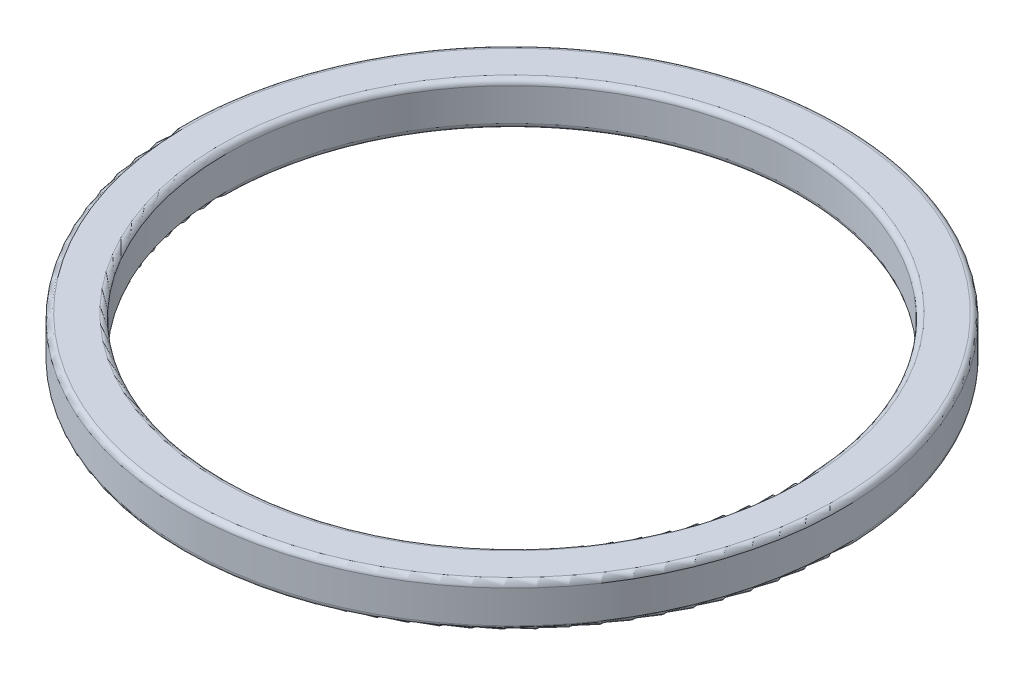
ISO-10303-21;
HEADER;
FILE_DESCRIPTION(('STEP AP214'),'2;1');
FILE_NAME('part.step','',(''),(''),'','','');
FILE_SCHEMA(('AUTOMOTIVE_DESIGN { 1 0 10303 214 1 1 1 1 }'));
ENDSEC;
DATA;
#1=APPLICATION_CONTEXT('core data for automotive mechanical design processes');
#2=APPLICATION_PROTOCOL_DEFINITION('international standard','automotive_design',2000,#1);
#3=PRODUCT_CONTEXT('',#1,'mechanical');
#4=PRODUCT('Part','Part','',(#3));
#5=PRODUCT_RELATED_PRODUCT_CATEGORY('part','',(#4));
#6=PRODUCT_DEFINITION_FORMATION('','',#4);
#7=PRODUCT_DEFINITION_CONTEXT('part definition',#1,'design');
#8=PRODUCT_DEFINITION('design','',#6,#7);
#9=PRODUCT_DEFINITION_SHAPE('','',#8);
#10=(LENGTH_UNIT() NAMED_UNIT(*) SI_UNIT(.MILLI.,.METRE.));
#11=(NAMED_UNIT(*) PLANE_ANGLE_UNIT() SI_UNIT($,.RADIAN.));
#12=(NAMED_UNIT(*) SI_UNIT($,.STERADIAN.) SOLID_ANGLE_UNIT());
#13=UNCERTAINTY_MEASURE_WITH_UNIT(LENGTH_MEASURE(1.E-05),#10,'distance_accuracy_value','');
#14=(GEOMETRIC_REPRESENTATION_CONTEXT(3) GLOBAL_UNCERTAINTY_ASSIGNED_CONTEXT((#13)) GLOBAL_UNIT_ASSIGNED_CONTEXT((#10,
#11,#12)) REPRESENTATION_CONTEXT('',''));
#15=CARTESIAN_POINT('',(0.,0.,0.));
#16=DIRECTION('',(0.,0.,1.));
#17=DIRECTION('',(1.,0.,0.));
#18=AXIS2_PLACEMENT_3D('',#15,#16,#17);
#19=CARTESIAN_POINT('',(0.,1.6,0.));
#20=DIRECTION('',(0.,1.,0.));
#21=DIRECTION('',(0.,0.,1.));
#22=AXIS2_PLACEMENT_3D('',#19,#20,#21);
#23=PLANE('',#22);
#24=CARTESIAN_POINT('',(0.,1.6,0.));
#25=DIRECTION('',(0.,1.,0.));
#26=DIRECTION('',(0.,0.,1.));
#27=AXIS2_PLACEMENT_3D('',#24,#25,#26);
#28=CIRCLE('',#27,11.9);
#29=CARTESIAN_POINT('',(0.,1.6,11.9));
#30=VERTEX_POINT('',#29);
#31=EDGE_CURVE('E66',#30,#30,#28,.T.);
#32=ORIENTED_EDGE('',*,*,#31,.T.);
#33=EDGE_LOOP('',(#32));
#34=FACE_BOUND('',#33,.T.);
#35=CARTESIAN_POINT('',(0.,1.6,0.));
#36=DIRECTION('',(0.,1.,0.));
#37=DIRECTION('',(0.,0.,1.));
#38=AXIS2_PLACEMENT_3D('',#35,#36,#37);
#39=CIRCLE('',#38,10.7);
#40=CARTESIAN_POINT('',(0.,1.6,10.7));
#41=VERTEX_POINT('',#40);
#42=EDGE_CURVE('E73',#41,#41,#39,.F.);
#43=ORIENTED_EDGE('',*,*,#42,.T.);
#44=EDGE_LOOP('',(#43));
#45=FACE_BOUND('',#44,.T.);
#46=ADVANCED_FACE('F54',(#34,#45),#23,.T.);
#47=CARTESIAN_POINT('',(0.,0.,0.));
#48=DIRECTION('',(0.,1.,0.));
#49=DIRECTION('',(0.,0.,1.));
#50=AXIS2_PLACEMENT_3D('',#47,#48,#49);
#51=PLANE('',#50);
#52=CARTESIAN_POINT('',(0.,0.,0.));
#53=DIRECTION('',(0.,1.,0.));
#54=DIRECTION('',(0.,0.,1.));
#55=AXIS2_PLACEMENT_3D('',#52,#53,#54);
#56=CIRCLE('',#55,11.9);
#57=CARTESIAN_POINT('',(0.,0.,11.9));
#58=VERTEX_POINT('',#57);
#59=EDGE_CURVE('E80',#58,#58,#56,.F.);
#60=ORIENTED_EDGE('',*,*,#59,.T.);
#61=EDGE_LOOP('',(#60));
#62=FACE_BOUND('',#61,.T.);
#63=CARTESIAN_POINT('',(0.,0.,0.));
#64=DIRECTION('',(0.,1.,0.));
#65=DIRECTION('',(0.,0.,1.));
#66=AXIS2_PLACEMENT_3D('',#63,#64,#65);
#67=CIRCLE('',#66,10.7);
#68=CARTESIAN_POINT('',(0.,0.,10.7));
#69=VERTEX_POINT('',#68);
#70=EDGE_CURVE('E81',#69,#69,#67,.T.);
#71=ORIENTED_EDGE('',*,*,#70,.T.);
#72=EDGE_LOOP('',(#71));
#73=FACE_BOUND('',#72,.T.);
#74=ADVANCED_FACE('F108',(#62,#73),#51,.F.);
#75=CARTESIAN_POINT('',(0.,1.6,0.));
#76=DIRECTION('',(0.,-1.,0.));
#77=DIRECTION('',(0.,0.,-1.));
#78=AXIS2_PLACEMENT_3D('',#75,#76,#77);
#79=CYLINDRICAL_SURFACE('',#78,12.1);
#80=CARTESIAN_POINT('',(0.,0.2,0.));
#81=DIRECTION('',(0.,1.,0.));
#82=DIRECTION('',(0.,0.,1.));
#83=AXIS2_PLACEMENT_3D('',#80,#81,#82);
#84=CIRCLE('',#83,12.1);
#85=CARTESIAN_POINT('',(0.,0.2,12.1));
#86=VERTEX_POINT('',#85);
#87=EDGE_CURVE('E90',#86,#86,#84,.T.);
#88=ORIENTED_EDGE('',*,*,#87,.T.);
#89=EDGE_LOOP('',(#88));
#90=FACE_BOUND('',#89,.T.);
#91=CARTESIAN_POINT('',(0.,1.4,0.));
#92=DIRECTION('',(0.,1.,0.));
#93=DIRECTION('',(0.,0.,1.));
#94=AXIS2_PLACEMENT_3D('',#91,#92,#93);
#95=CIRCLE('',#94,12.1);
#96=CARTESIAN_POINT('',(0.,1.4,12.1));
#97=VERTEX_POINT('',#96);
#98=EDGE_CURVE('E91',#97,#97,#95,.F.);
#99=ORIENTED_EDGE('',*,*,#98,.T.);
#100=EDGE_LOOP('',(#99));
#101=FACE_BOUND('',#100,.T.);
#102=ADVANCED_FACE('F96',(#90,#101),#79,.T.);
#103=CARTESIAN_POINT('',(0.,1.6,0.));
#104=DIRECTION('',(0.,-1.,0.));
#105=DIRECTION('',(0.,0.,-1.));
#106=AXIS2_PLACEMENT_3D('',#103,#104,#105);
#107=CYLINDRICAL_SURFACE('',#106,10.5);
#108=CARTESIAN_POINT('',(0.,0.2,0.));
#109=DIRECTION('',(0.,1.,0.));
#110=DIRECTION('',(0.,0.,1.));
#111=AXIS2_PLACEMENT_3D('',#108,#109,#110);
#112=CIRCLE('',#111,10.5);
#113=CARTESIAN_POINT('',(0.,0.2,10.5));
#114=VERTEX_POINT('',#113);
#115=EDGE_CURVE('E11',#114,#114,#112,.F.);
#116=ORIENTED_EDGE('',*,*,#115,.T.);
#117=EDGE_LOOP('',(#116));
#118=FACE_BOUND('',#117,.T.);
#119=CARTESIAN_POINT('',(0.,1.4,0.));
#120=DIRECTION('',(0.,1.,0.));
#121=DIRECTION('',(0.,0.,1.));
#122=AXIS2_PLACEMENT_3D('',#119,#120,#121);
#123=CIRCLE('',#122,10.5);
#124=CARTESIAN_POINT('',(0.,1.4,10.5));
#125=VERTEX_POINT('',#124);
#126=EDGE_CURVE('E63',#125,#125,#123,.T.);
#127=ORIENTED_EDGE('',*,*,#126,.T.);
#128=EDGE_LOOP('',(#127));
#129=FACE_BOUND('',#128,.T.);
#130=ADVANCED_FACE('F125',(#118,#129),#107,.F.);
#131=CARTESIAN_POINT('',(0.,0.2,0.));
#132=DIRECTION('',(0.,1.,0.));
#133=DIRECTION('',(0.,0.,1.));
#134=AXIS2_PLACEMENT_3D('',#131,#132,#133);
#135=TOROIDAL_SURFACE('',#134,11.9,0.2);
#136=ORIENTED_EDGE('',*,*,#59,.F.);
#137=EDGE_LOOP('',(#136));
#138=FACE_BOUND('',#137,.T.);
#139=ORIENTED_EDGE('',*,*,#87,.F.);
#140=EDGE_LOOP('',(#139));
#141=FACE_BOUND('',#140,.T.);
#142=ADVANCED_FACE('F105',(#138,#141),#135,.T.);
#143=CARTESIAN_POINT('',(0.,1.4,0.));
#144=DIRECTION('',(0.,1.,0.));
#145=DIRECTION('',(0.,0.,1.));
#146=AXIS2_PLACEMENT_3D('',#143,#144,#145);
#147=TOROIDAL_SURFACE('',#146,11.9,0.2);
#148=ORIENTED_EDGE('',*,*,#98,.F.);
#149=EDGE_LOOP('',(#148));
#150=FACE_BOUND('',#149,.T.);
#151=ORIENTED_EDGE('',*,*,#31,.F.);
#152=EDGE_LOOP('',(#151));
#153=FACE_BOUND('',#152,.T.);
#154=ADVANCED_FACE('F97',(#150,#153),#147,.T.);
#155=CARTESIAN_POINT('',(0.,0.2,0.));
#156=DIRECTION('',(0.,1.,0.));
#157=DIRECTION('',(0.,0.,1.));
#158=AXIS2_PLACEMENT_3D('',#155,#156,#157);
#159=TOROIDAL_SURFACE('',#158,10.7,0.2);
#160=ORIENTED_EDGE('',*,*,#115,.F.);
#161=EDGE_LOOP('',(#160));
#162=FACE_BOUND('',#161,.T.);
#163=ORIENTED_EDGE('',*,*,#70,.F.);
#164=EDGE_LOOP('',(#163));
#165=FACE_BOUND('',#164,.T.);
#166=ADVANCED_FACE('F102',(#162,#165),#159,.T.);
#167=CARTESIAN_POINT('',(0.,1.4,0.));
#168=DIRECTION('',(0.,1.,0.));
#169=DIRECTION('',(0.,0.,1.));
#170=AXIS2_PLACEMENT_3D('',#167,#168,#169);
#171=TOROIDAL_SURFACE('',#170,10.7,0.2);
#172=ORIENTED_EDGE('',*,*,#42,.F.);
#173=EDGE_LOOP('',(#172));
#174=FACE_BOUND('',#173,.T.);
#175=ORIENTED_EDGE('',*,*,#126,.F.);
#176=EDGE_LOOP('',(#175));
#177=FACE_BOUND('',#176,.T.);
#178=ADVANCED_FACE('F60',(#174,#177),#171,.T.);
#179=CLOSED_SHELL('',(#46,#74,#102,#130,#142,#154,#166,#178));
#180=MANIFOLD_SOLID_BREP('B2',#179);
#181=ADVANCED_BREP_SHAPE_REPRESENTATION('',(#18,#180),#14);
#182=SHAPE_DEFINITION_REPRESENTATION(#9,#181);
ENDSEC;
END-ISO-10303-21;
